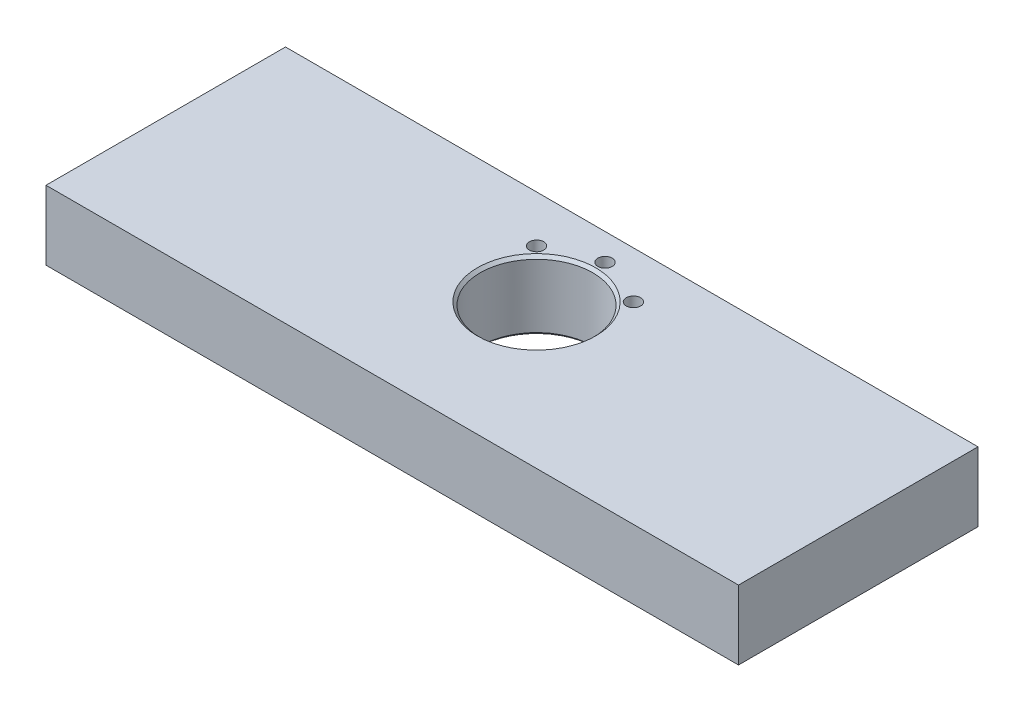
ISO-10303-21;
HEADER;
FILE_DESCRIPTION(('STEP AP214'),'2;1');
FILE_NAME('part.step','',(''),(''),'','','');
FILE_SCHEMA(('AUTOMOTIVE_DESIGN { 1 0 10303 214 1 1 1 1 }'));
ENDSEC;
DATA;
#1=APPLICATION_CONTEXT('core data for automotive mechanical design processes');
#2=APPLICATION_PROTOCOL_DEFINITION('international standard','automotive_design',2000,#1);
#3=PRODUCT_CONTEXT('',#1,'mechanical');
#4=PRODUCT('Part','Part','',(#3));
#5=PRODUCT_RELATED_PRODUCT_CATEGORY('part','',(#4));
#6=PRODUCT_DEFINITION_FORMATION('','',#4);
#7=PRODUCT_DEFINITION_CONTEXT('part definition',#1,'design');
#8=PRODUCT_DEFINITION('design','',#6,#7);
#9=PRODUCT_DEFINITION_SHAPE('','',#8);
#10=(LENGTH_UNIT() NAMED_UNIT(*) SI_UNIT(.MILLI.,.METRE.));
#11=(NAMED_UNIT(*) PLANE_ANGLE_UNIT() SI_UNIT($,.RADIAN.));
#12=(NAMED_UNIT(*) SI_UNIT($,.STERADIAN.) SOLID_ANGLE_UNIT());
#13=UNCERTAINTY_MEASURE_WITH_UNIT(LENGTH_MEASURE(1.E-05),#10,'distance_accuracy_value','');
#14=(GEOMETRIC_REPRESENTATION_CONTEXT(3) GLOBAL_UNCERTAINTY_ASSIGNED_CONTEXT((#13)) GLOBAL_UNIT_ASSIGNED_CONTEXT((#10,
#11,#12)) REPRESENTATION_CONTEXT('',''));
#15=CARTESIAN_POINT('',(0.,0.,0.));
#16=DIRECTION('',(0.,0.,1.));
#17=DIRECTION('',(1.,0.,0.));
#18=AXIS2_PLACEMENT_3D('',#15,#16,#17);
#19=CARTESIAN_POINT('',(-196.679347611489,-587.179524908949,-866.48578652296));
#20=DIRECTION('',(0.,-1.,0.));
#21=DIRECTION('',(0.,0.,-1.));
#22=AXIS2_PLACEMENT_3D('',#19,#20,#21);
#23=CONICAL_SURFACE('',#22,20.5,0.785398163397448);
#24=CARTESIAN_POINT('',(-196.679347611489,-586.179524908949,-866.48578652296));
#25=DIRECTION('',(0.,-1.,0.));
#26=DIRECTION('',(0.,0.,-1.));
#27=AXIS2_PLACEMENT_3D('',#24,#25,#26);
#28=CIRCLE('',#27,19.5);
#29=CARTESIAN_POINT('',(-196.679347611489,-586.179524908949,-885.98578652296));
#30=VERTEX_POINT('',#29);
#31=EDGE_CURVE('E67',#30,#30,#28,.F.);
#32=ORIENTED_EDGE('',*,*,#31,.T.);
#33=EDGE_LOOP('',(#32));
#34=FACE_BOUND('',#33,.T.);
#35=CARTESIAN_POINT('',(-196.679347611489,-587.179524908949,-866.48578652296));
#36=DIRECTION('',(0.,-1.,0.));
#37=DIRECTION('',(0.,0.,-1.));
#38=AXIS2_PLACEMENT_3D('',#35,#36,#37);
#39=CIRCLE('',#38,20.5);
#40=CARTESIAN_POINT('',(-196.679347611489,-587.179524908949,-886.98578652296));
#41=VERTEX_POINT('',#40);
#42=EDGE_CURVE('E20',#41,#41,#39,.T.);
#43=ORIENTED_EDGE('',*,*,#42,.T.);
#44=EDGE_LOOP('',(#43));
#45=FACE_BOUND('',#44,.T.);
#46=ADVANCED_FACE('F17',(#34,#45),#23,.F.);
#47=CARTESIAN_POINT('',(-196.679347611489,-587.179524908949,-866.48578652296));
#48=DIRECTION('',(0.,1.,0.));
#49=DIRECTION('',(0.,0.,1.));
#50=AXIS2_PLACEMENT_3D('',#47,#48,#49);
#51=PLANE('',#50);
#52=ORIENTED_EDGE('',*,*,#42,.F.);
#53=EDGE_LOOP('',(#52));
#54=FACE_BOUND('',#53,.T.);
#55=CARTESIAN_POINT('',(-179.887132141441,-587.179524908949,-883.278300867881));
#56=DIRECTION('',(0.,-1.,0.));
#57=DIRECTION('',(0.,0.,-1.));
#58=AXIS2_PLACEMENT_3D('',#55,#56,#57);
#59=CIRCLE('',#58,2.5);
#60=CARTESIAN_POINT('',(-179.887132141441,-587.179524908949,-885.778300867881));
#61=VERTEX_POINT('',#60);
#62=EDGE_CURVE('E85',#61,#61,#59,.F.);
#63=ORIENTED_EDGE('',*,*,#62,.T.);
#64=EDGE_LOOP('',(#63));
#65=FACE_BOUND('',#64,.T.);
#66=CARTESIAN_POINT('',(-196.679327362805,-587.179524908949,-890.233855870586));
#67=DIRECTION('',(0.,-1.,0.));
#68=DIRECTION('',(0.,0.,-1.));
#69=AXIS2_PLACEMENT_3D('',#66,#67,#68);
#70=CIRCLE('',#69,2.5);
#71=CARTESIAN_POINT('',(-196.679327362805,-587.179524908949,-892.733855870586));
#72=VERTEX_POINT('',#71);
#73=EDGE_CURVE('E99',#72,#72,#70,.F.);
#74=ORIENTED_EDGE('',*,*,#73,.T.);
#75=EDGE_LOOP('',(#74));
#76=FACE_BOUND('',#75,.T.);
#77=CARTESIAN_POINT('',(-213.47152258417,-587.179524908949,-883.278300867881));
#78=DIRECTION('',(0.,-1.,0.));
#79=DIRECTION('',(0.,0.,-1.));
#80=AXIS2_PLACEMENT_3D('',#77,#78,#79);
#81=CIRCLE('',#80,2.5);
#82=CARTESIAN_POINT('',(-213.47152258417,-587.179524908949,-885.778300867881));
#83=VERTEX_POINT('',#82);
#84=EDGE_CURVE('E101',#83,#83,#81,.F.);
#85=ORIENTED_EDGE('',*,*,#84,.T.);
#86=EDGE_LOOP('',(#85));
#87=FACE_BOUND('',#86,.T.);
#88=DIRECTION('',(0.,0.,1.));
#89=VECTOR('',#88,1.);
#90=CARTESIAN_POINT('',(-76.6793476114885,-587.179524908949,-866.48578652296));
#91=LINE('',#90,#89);
#92=CARTESIAN_POINT('',(-76.6793476114885,-587.179524908949,-899.48578652296));
#93=VERTEX_POINT('',#92);
#94=CARTESIAN_POINT('',(-76.6793476114885,-587.179524908949,-816.485801569322));
#95=VERTEX_POINT('',#94);
#96=EDGE_CURVE('E112',#93,#95,#91,.T.);
#97=ORIENTED_EDGE('',*,*,#96,.T.);
#98=DIRECTION('',(-1.,0.,0.));
#99=VECTOR('',#98,1.);
#100=CARTESIAN_POINT('',(-196.679354193757,-587.179524908949,-816.485801569322));
#101=LINE('',#100,#99);
#102=CARTESIAN_POINT('',(-316.679347611488,-587.179524908949,-816.485801569322));
#103=VERTEX_POINT('',#102);
#104=EDGE_CURVE('E61',#95,#103,#101,.T.);
#105=ORIENTED_EDGE('',*,*,#104,.T.);
#106=DIRECTION('',(0.,0.,1.));
#107=VECTOR('',#106,1.);
#108=CARTESIAN_POINT('',(-316.679347611488,-587.179524908949,-866.48578652296));
#109=LINE('',#108,#107);
#110=CARTESIAN_POINT('',(-316.679347611488,-587.179524908949,-899.48578652296));
#111=VERTEX_POINT('',#110);
#112=EDGE_CURVE('E59',#111,#103,#109,.T.);
#113=ORIENTED_EDGE('',*,*,#112,.F.);
#114=DIRECTION('',(1.,0.,0.));
#115=VECTOR('',#114,1.);
#116=CARTESIAN_POINT('',(-196.679347611489,-587.179524908949,-899.48578652296));
#117=LINE('',#116,#115);
#118=EDGE_CURVE('E56',#111,#93,#117,.T.);
#119=ORIENTED_EDGE('',*,*,#118,.T.);
#120=EDGE_LOOP('',(#97,#105,#113,#119));
#121=FACE_BOUND('',#120,.T.);
#122=ADVANCED_FACE('F60',(#54,#65,#76,#87,#121),#51,.F.);
#123=CARTESIAN_POINT('',(-196.679347611489,-563.179524908949,-866.48578652296));
#124=DIRECTION('',(0.,-1.,0.));
#125=DIRECTION('',(0.,0.,-1.));
#126=AXIS2_PLACEMENT_3D('',#123,#124,#125);
#127=CYLINDRICAL_SURFACE('',#126,19.5);
#128=ORIENTED_EDGE('',*,*,#31,.F.);
#129=EDGE_LOOP('',(#128));
#130=FACE_BOUND('',#129,.T.);
#131=CARTESIAN_POINT('',(-196.679347611489,-564.179524908948,-866.48578652296));
#132=DIRECTION('',(0.,1.,0.));
#133=DIRECTION('',(1.,0.,0.));
#134=AXIS2_PLACEMENT_3D('',#131,#132,#133);
#135=CIRCLE('',#134,19.500000000001);
#136=CARTESIAN_POINT('',(-177.179347611488,-564.179524908948,-866.48578652296));
#137=VERTEX_POINT('',#136);
#138=EDGE_CURVE('E82',#137,#137,#135,.T.);
#139=ORIENTED_EDGE('',*,*,#138,.T.);
#140=EDGE_LOOP('',(#139));
#141=FACE_BOUND('',#140,.T.);
#142=ADVANCED_FACE('F157',(#130,#141),#127,.F.);
#143=CARTESIAN_POINT('',(-316.679347611488,-575.179524908949,-866.48578652296));
#144=DIRECTION('',(-1.,0.,0.));
#145=DIRECTION('',(0.,0.,1.));
#146=AXIS2_PLACEMENT_3D('',#143,#144,#145);
#147=PLANE('',#146);
#148=DIRECTION('',(0.,0.,-1.));
#149=VECTOR('',#148,1.);
#150=CARTESIAN_POINT('',(-316.679347611488,-563.179524908949,-866.48578652296));
#151=LINE('',#150,#149);
#152=CARTESIAN_POINT('',(-316.679347611488,-563.179524908949,-816.485801569322));
#153=VERTEX_POINT('',#152);
#154=CARTESIAN_POINT('',(-316.679347611488,-563.179524908949,-899.48578652296));
#155=VERTEX_POINT('',#154);
#156=EDGE_CURVE('E78',#153,#155,#151,.T.);
#157=ORIENTED_EDGE('',*,*,#156,.T.);
#158=DIRECTION('',(0.,1.,0.));
#159=VECTOR('',#158,1.);
#160=CARTESIAN_POINT('',(-316.679347611488,-575.179524908949,-899.48578652296));
#161=LINE('',#160,#159);
#162=EDGE_CURVE('E66',#155,#111,#161,.F.);
#163=ORIENTED_EDGE('',*,*,#162,.T.);
#164=ORIENTED_EDGE('',*,*,#112,.T.);
#165=DIRECTION('',(0.,1.,0.));
#166=VECTOR('',#165,1.);
#167=CARTESIAN_POINT('',(-316.679347611488,-575.179526308202,-816.485801569322));
#168=LINE('',#167,#166);
#169=EDGE_CURVE('E106',#103,#153,#168,.T.);
#170=ORIENTED_EDGE('',*,*,#169,.T.);
#171=EDGE_LOOP('',(#157,#163,#164,#170));
#172=FACE_BOUND('',#171,.T.);
#173=ADVANCED_FACE('F77',(#172),#147,.T.);
#174=CARTESIAN_POINT('',(-196.679347611489,-575.179524908949,-899.48578652296));
#175=DIRECTION('',(0.,0.,1.));
#176=DIRECTION('',(1.,0.,0.));
#177=AXIS2_PLACEMENT_3D('',#174,#175,#176);
#178=PLANE('',#177);
#179=DIRECTION('',(0.,1.,0.));
#180=VECTOR('',#179,1.);
#181=CARTESIAN_POINT('',(-76.6793476114885,-575.179524908949,-899.48578652296));
#182=LINE('',#181,#180);
#183=CARTESIAN_POINT('',(-76.6793476114885,-563.179524908949,-899.48578652296));
#184=VERTEX_POINT('',#183);
#185=EDGE_CURVE('E74',#184,#93,#182,.F.);
#186=ORIENTED_EDGE('',*,*,#185,.T.);
#187=ORIENTED_EDGE('',*,*,#118,.F.);
#188=ORIENTED_EDGE('',*,*,#162,.F.);
#189=DIRECTION('',(1.,0.,0.));
#190=VECTOR('',#189,1.);
#191=CARTESIAN_POINT('',(-196.679347611489,-563.179524908949,-899.48578652296));
#192=LINE('',#191,#190);
#193=EDGE_CURVE('E120',#155,#184,#192,.T.);
#194=ORIENTED_EDGE('',*,*,#193,.T.);
#195=EDGE_LOOP('',(#186,#187,#188,#194));
#196=FACE_BOUND('',#195,.T.);
#197=ADVANCED_FACE('F71',(#196),#178,.F.);
#198=CARTESIAN_POINT('',(-76.6793476114885,-575.179524908949,-866.48578652296));
#199=DIRECTION('',(-1.,0.,0.));
#200=DIRECTION('',(0.,0.,1.));
#201=AXIS2_PLACEMENT_3D('',#198,#199,#200);
#202=PLANE('',#201);
#203=ORIENTED_EDGE('',*,*,#185,.F.);
#204=DIRECTION('',(0.,0.,-1.));
#205=VECTOR('',#204,1.);
#206=CARTESIAN_POINT('',(-76.6793476114885,-563.179524908949,-866.48578652296));
#207=LINE('',#206,#205);
#208=CARTESIAN_POINT('',(-76.6793476114885,-563.179524908949,-816.485801569322));
#209=VERTEX_POINT('',#208);
#210=EDGE_CURVE('E118',#184,#209,#207,.F.);
#211=ORIENTED_EDGE('',*,*,#210,.T.);
#212=DIRECTION('',(0.,1.,0.));
#213=VECTOR('',#212,1.);
#214=CARTESIAN_POINT('',(-76.6793476114885,-575.179526308202,-816.485801569322));
#215=LINE('',#214,#213);
#216=EDGE_CURVE('E35',#209,#95,#215,.F.);
#217=ORIENTED_EDGE('',*,*,#216,.T.);
#218=ORIENTED_EDGE('',*,*,#96,.F.);
#219=EDGE_LOOP('',(#203,#211,#217,#218));
#220=FACE_BOUND('',#219,.T.);
#221=ADVANCED_FACE('F116',(#220),#202,.F.);
#222=CARTESIAN_POINT('',(-196.679354193757,-575.179526308202,-816.485801569322));
#223=DIRECTION('',(0.,0.,-1.));
#224=DIRECTION('',(-1.,0.,0.));
#225=AXIS2_PLACEMENT_3D('',#222,#223,#224);
#226=PLANE('',#225);
#227=ORIENTED_EDGE('',*,*,#216,.F.);
#228=DIRECTION('',(1.,0.,0.));
#229=VECTOR('',#228,1.);
#230=CARTESIAN_POINT('',(-196.679347611489,-563.179524908949,-816.485801569322));
#231=LINE('',#230,#229);
#232=EDGE_CURVE('E96',#209,#153,#231,.F.);
#233=ORIENTED_EDGE('',*,*,#232,.T.);
#234=ORIENTED_EDGE('',*,*,#169,.F.);
#235=ORIENTED_EDGE('',*,*,#104,.F.);
#236=EDGE_LOOP('',(#227,#233,#234,#235));
#237=FACE_BOUND('',#236,.T.);
#238=ADVANCED_FACE('F114',(#237),#226,.F.);
#239=CARTESIAN_POINT('',(-213.47152258417,-563.179524908949,-883.278300867881));
#240=DIRECTION('',(0.,-1.,0.));
#241=DIRECTION('',(0.,0.,-1.));
#242=AXIS2_PLACEMENT_3D('',#239,#240,#241);
#243=CYLINDRICAL_SURFACE('',#242,2.5);
#244=ORIENTED_EDGE('',*,*,#84,.F.);
#245=EDGE_LOOP('',(#244));
#246=FACE_BOUND('',#245,.T.);
#247=CARTESIAN_POINT('',(-213.47152258417,-563.179524908949,-883.278300867881));
#248=DIRECTION('',(0.,-1.,0.));
#249=DIRECTION('',(0.,0.,-1.));
#250=AXIS2_PLACEMENT_3D('',#247,#248,#249);
#251=CIRCLE('',#250,2.5);
#252=CARTESIAN_POINT('',(-213.47152258417,-563.179524908949,-885.778300867881));
#253=VERTEX_POINT('',#252);
#254=EDGE_CURVE('E93',#253,#253,#251,.F.);
#255=ORIENTED_EDGE('',*,*,#254,.T.);
#256=EDGE_LOOP('',(#255));
#257=FACE_BOUND('',#256,.T.);
#258=ADVANCED_FACE('F144',(#246,#257),#243,.F.);
#259=CARTESIAN_POINT('',(-196.679327362805,-563.179524908949,-890.233855870586));
#260=DIRECTION('',(0.,-1.,0.));
#261=DIRECTION('',(0.,0.,-1.));
#262=AXIS2_PLACEMENT_3D('',#259,#260,#261);
#263=CYLINDRICAL_SURFACE('',#262,2.5);
#264=ORIENTED_EDGE('',*,*,#73,.F.);
#265=EDGE_LOOP('',(#264));
#266=FACE_BOUND('',#265,.T.);
#267=CARTESIAN_POINT('',(-196.679327362805,-563.179524908949,-890.233855870586));
#268=DIRECTION('',(0.,-1.,0.));
#269=DIRECTION('',(0.,0.,-1.));
#270=AXIS2_PLACEMENT_3D('',#267,#268,#269);
#271=CIRCLE('',#270,2.5);
#272=CARTESIAN_POINT('',(-196.679327362805,-563.179524908949,-892.733855870586));
#273=VERTEX_POINT('',#272);
#274=EDGE_CURVE('E90',#273,#273,#271,.F.);
#275=ORIENTED_EDGE('',*,*,#274,.T.);
#276=EDGE_LOOP('',(#275));
#277=FACE_BOUND('',#276,.T.);
#278=ADVANCED_FACE('F140',(#266,#277),#263,.F.);
#279=CARTESIAN_POINT('',(-179.887132141441,-563.179524908949,-883.278300867881));
#280=DIRECTION('',(0.,-1.,0.));
#281=DIRECTION('',(0.,0.,-1.));
#282=AXIS2_PLACEMENT_3D('',#279,#280,#281);
#283=CYLINDRICAL_SURFACE('',#282,2.5);
#284=ORIENTED_EDGE('',*,*,#62,.F.);
#285=EDGE_LOOP('',(#284));
#286=FACE_BOUND('',#285,.T.);
#287=CARTESIAN_POINT('',(-179.887132141441,-563.179524908949,-883.278300867881));
#288=DIRECTION('',(0.,-1.,0.));
#289=DIRECTION('',(0.,0.,-1.));
#290=AXIS2_PLACEMENT_3D('',#287,#288,#289);
#291=CIRCLE('',#290,2.5);
#292=CARTESIAN_POINT('',(-179.887132141441,-563.179524908949,-885.778300867881));
#293=VERTEX_POINT('',#292);
#294=EDGE_CURVE('E26',#293,#293,#291,.F.);
#295=ORIENTED_EDGE('',*,*,#294,.T.);
#296=EDGE_LOOP('',(#295));
#297=FACE_BOUND('',#296,.T.);
#298=ADVANCED_FACE('F132',(#286,#297),#283,.F.);
#299=CARTESIAN_POINT('',(-196.679347611489,-563.179524908949,-866.48578652296));
#300=DIRECTION('',(0.,1.,0.));
#301=DIRECTION('',(0.,0.,1.));
#302=AXIS2_PLACEMENT_3D('',#299,#300,#301);
#303=CONICAL_SURFACE('',#302,20.5,0.785398163397448);
#304=ORIENTED_EDGE('',*,*,#138,.F.);
#305=EDGE_LOOP('',(#304));
#306=FACE_BOUND('',#305,.T.);
#307=CARTESIAN_POINT('',(-196.679347611489,-563.179524908949,-866.48578652296));
#308=DIRECTION('',(0.,1.,0.));
#309=DIRECTION('',(0.,0.,1.));
#310=AXIS2_PLACEMENT_3D('',#307,#308,#309);
#311=CIRCLE('',#310,20.5);
#312=CARTESIAN_POINT('',(-196.679347611489,-563.179524908949,-845.98578652296));
#313=VERTEX_POINT('',#312);
#314=EDGE_CURVE('E11',#313,#313,#311,.T.);
#315=ORIENTED_EDGE('',*,*,#314,.T.);
#316=EDGE_LOOP('',(#315));
#317=FACE_BOUND('',#316,.T.);
#318=ADVANCED_FACE('F125',(#306,#317),#303,.F.);
#319=CARTESIAN_POINT('',(-196.679347611489,-563.179524908949,-866.48578652296));
#320=DIRECTION('',(0.,-1.,0.));
#321=DIRECTION('',(0.,0.,-1.));
#322=AXIS2_PLACEMENT_3D('',#319,#320,#321);
#323=PLANE('',#322);
#324=ORIENTED_EDGE('',*,*,#314,.F.);
#325=EDGE_LOOP('',(#324));
#326=FACE_BOUND('',#325,.T.);
#327=ORIENTED_EDGE('',*,*,#294,.F.);
#328=EDGE_LOOP('',(#327));
#329=FACE_BOUND('',#328,.T.);
#330=ORIENTED_EDGE('',*,*,#274,.F.);
#331=EDGE_LOOP('',(#330));
#332=FACE_BOUND('',#331,.T.);
#333=ORIENTED_EDGE('',*,*,#254,.F.);
#334=EDGE_LOOP('',(#333));
#335=FACE_BOUND('',#334,.T.);
#336=ORIENTED_EDGE('',*,*,#210,.F.);
#337=ORIENTED_EDGE('',*,*,#193,.F.);
#338=ORIENTED_EDGE('',*,*,#156,.F.);
#339=ORIENTED_EDGE('',*,*,#232,.F.);
#340=EDGE_LOOP('',(#336,#337,#338,#339));
#341=FACE_BOUND('',#340,.T.);
#342=ADVANCED_FACE('F123',(#326,#329,#332,#335,#341),#323,.F.);
#343=CLOSED_SHELL('',(#46,#122,#142,#173,#197,#221,#238,#258,#278,#298,#318,#342));
#344=MANIFOLD_SOLID_BREP('B1',#343);
#345=ADVANCED_BREP_SHAPE_REPRESENTATION('',(#18,#344),#14);
#346=SHAPE_DEFINITION_REPRESENTATION(#9,#345);
ENDSEC;
END-ISO-10303-21;
